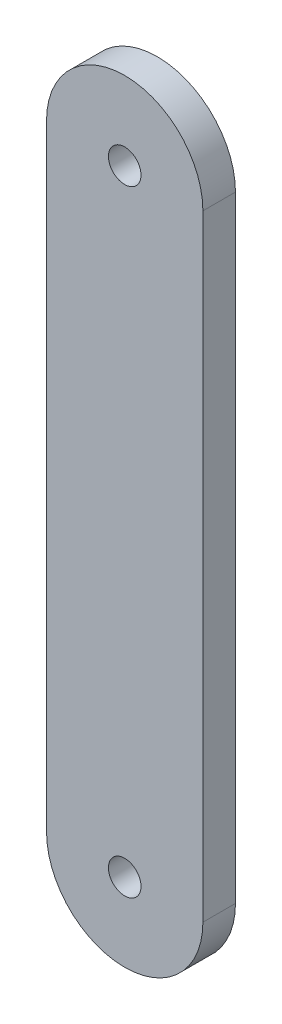
ISO-10303-21;
HEADER;
FILE_DESCRIPTION(('STEP AP214'),'2;1');
FILE_NAME('part.step','',(''),(''),'','','');
FILE_SCHEMA(('AUTOMOTIVE_DESIGN { 1 0 10303 214 1 1 1 1 }'));
ENDSEC;
DATA;
#1=APPLICATION_CONTEXT('core data for automotive mechanical design processes');
#2=APPLICATION_PROTOCOL_DEFINITION('international standard','automotive_design',2000,#1);
#3=PRODUCT_CONTEXT('',#1,'mechanical');
#4=PRODUCT('Part','Part','',(#3));
#5=PRODUCT_RELATED_PRODUCT_CATEGORY('part','',(#4));
#6=PRODUCT_DEFINITION_FORMATION('','',#4);
#7=PRODUCT_DEFINITION_CONTEXT('part definition',#1,'design');
#8=PRODUCT_DEFINITION('design','',#6,#7);
#9=PRODUCT_DEFINITION_SHAPE('','',#8);
#10=(LENGTH_UNIT() NAMED_UNIT(*) SI_UNIT(.MILLI.,.METRE.));
#11=(NAMED_UNIT(*) PLANE_ANGLE_UNIT() SI_UNIT($,.RADIAN.));
#12=(NAMED_UNIT(*) SI_UNIT($,.STERADIAN.) SOLID_ANGLE_UNIT());
#13=UNCERTAINTY_MEASURE_WITH_UNIT(LENGTH_MEASURE(1.E-05),#10,'distance_accuracy_value','');
#14=(GEOMETRIC_REPRESENTATION_CONTEXT(3) GLOBAL_UNCERTAINTY_ASSIGNED_CONTEXT((#13)) GLOBAL_UNIT_ASSIGNED_CONTEXT((#10,
#11,#12)) REPRESENTATION_CONTEXT('',''));
#15=CARTESIAN_POINT('',(0.,0.,0.));
#16=DIRECTION('',(0.,0.,1.));
#17=DIRECTION('',(1.,0.,0.));
#18=AXIS2_PLACEMENT_3D('',#15,#16,#17);
#19=CARTESIAN_POINT('',(0.,-47.2800000000001,0.));
#20=DIRECTION('',(0.,0.,1.));
#21=DIRECTION('',(1.,0.,0.));
#22=AXIS2_PLACEMENT_3D('',#19,#20,#21);
#23=CYLINDRICAL_SURFACE('',#22,12.);
#24=CARTESIAN_POINT('',(0.,-47.2800000000001,5.));
#25=DIRECTION('',(0.,0.,1.));
#26=DIRECTION('',(1.,0.,0.));
#27=AXIS2_PLACEMENT_3D('',#24,#25,#26);
#28=CIRCLE('',#27,12.);
#29=CARTESIAN_POINT('',(-12.,-47.28,5.));
#30=VERTEX_POINT('',#29);
#31=CARTESIAN_POINT('',(12.,-47.28,5.));
#32=VERTEX_POINT('',#31);
#33=EDGE_CURVE('E101',#30,#32,#28,.T.);
#34=ORIENTED_EDGE('',*,*,#33,.F.);
#35=DIRECTION('',(0.,0.,1.));
#36=VECTOR('',#35,1.);
#37=CARTESIAN_POINT('',(-12.,-47.28,0.));
#38=LINE('',#37,#36);
#39=CARTESIAN_POINT('',(-12.,-47.28,0.));
#40=VERTEX_POINT('',#39);
#41=EDGE_CURVE('E11',#40,#30,#38,.T.);
#42=ORIENTED_EDGE('',*,*,#41,.F.);
#43=CARTESIAN_POINT('',(0.,-47.2800000000001,0.));
#44=DIRECTION('',(0.,0.,1.));
#45=DIRECTION('',(1.,0.,0.));
#46=AXIS2_PLACEMENT_3D('',#43,#44,#45);
#47=CIRCLE('',#46,12.);
#48=CARTESIAN_POINT('',(12.,-47.28,0.));
#49=VERTEX_POINT('',#48);
#50=EDGE_CURVE('E94',#40,#49,#47,.T.);
#51=ORIENTED_EDGE('',*,*,#50,.T.);
#52=DIRECTION('',(0.,0.,1.));
#53=VECTOR('',#52,1.);
#54=CARTESIAN_POINT('',(12.,-47.28,0.));
#55=LINE('',#54,#53);
#56=EDGE_CURVE('E39',#49,#32,#55,.T.);
#57=ORIENTED_EDGE('',*,*,#56,.T.);
#58=EDGE_LOOP('',(#34,#42,#51,#57));
#59=FACE_BOUND('',#58,.T.);
#60=ADVANCED_FACE('F36',(#59),#23,.T.);
#61=CARTESIAN_POINT('',(-12.,47.28,0.));
#62=DIRECTION('',(-1.,0.,0.));
#63=DIRECTION('',(0.,0.,1.));
#64=AXIS2_PLACEMENT_3D('',#61,#62,#63);
#65=PLANE('',#64);
#66=DIRECTION('',(0.,-1.,0.));
#67=VECTOR('',#66,1.);
#68=CARTESIAN_POINT('',(-12.,47.28,5.));
#69=LINE('',#68,#67);
#70=CARTESIAN_POINT('',(-12.,47.28,5.));
#71=VERTEX_POINT('',#70);
#72=EDGE_CURVE('E96',#71,#30,#69,.T.);
#73=ORIENTED_EDGE('',*,*,#72,.F.);
#74=DIRECTION('',(0.,0.,1.));
#75=VECTOR('',#74,1.);
#76=CARTESIAN_POINT('',(-12.,47.28,0.));
#77=LINE('',#76,#75);
#78=CARTESIAN_POINT('',(-12.,47.28,0.));
#79=VERTEX_POINT('',#78);
#80=EDGE_CURVE('E45',#79,#71,#77,.T.);
#81=ORIENTED_EDGE('',*,*,#80,.F.);
#82=DIRECTION('',(0.,-1.,0.));
#83=VECTOR('',#82,1.);
#84=CARTESIAN_POINT('',(-12.,47.28,0.));
#85=LINE('',#84,#83);
#86=EDGE_CURVE('E91',#79,#40,#85,.T.);
#87=ORIENTED_EDGE('',*,*,#86,.T.);
#88=ORIENTED_EDGE('',*,*,#41,.T.);
#89=EDGE_LOOP('',(#73,#81,#87,#88));
#90=FACE_BOUND('',#89,.T.);
#91=ADVANCED_FACE('F112',(#90),#65,.T.);
#92=CARTESIAN_POINT('',(0.,47.2800000000001,0.));
#93=DIRECTION('',(0.,0.,1.));
#94=DIRECTION('',(1.,0.,0.));
#95=AXIS2_PLACEMENT_3D('',#92,#93,#94);
#96=CYLINDRICAL_SURFACE('',#95,12.);
#97=CARTESIAN_POINT('',(0.,47.2800000000001,5.));
#98=DIRECTION('',(0.,0.,1.));
#99=DIRECTION('',(1.,0.,0.));
#100=AXIS2_PLACEMENT_3D('',#97,#98,#99);
#101=CIRCLE('',#100,12.);
#102=CARTESIAN_POINT('',(12.,47.2800000000001,5.));
#103=VERTEX_POINT('',#102);
#104=EDGE_CURVE('E86',#103,#71,#101,.T.);
#105=ORIENTED_EDGE('',*,*,#104,.F.);
#106=DIRECTION('',(0.,0.,1.));
#107=VECTOR('',#106,1.);
#108=CARTESIAN_POINT('',(12.,47.2800000000001,0.));
#109=LINE('',#108,#107);
#110=CARTESIAN_POINT('',(12.,47.2800000000001,0.));
#111=VERTEX_POINT('',#110);
#112=EDGE_CURVE('E81',#111,#103,#109,.T.);
#113=ORIENTED_EDGE('',*,*,#112,.F.);
#114=CARTESIAN_POINT('',(0.,47.2800000000001,0.));
#115=DIRECTION('',(0.,0.,1.));
#116=DIRECTION('',(1.,0.,0.));
#117=AXIS2_PLACEMENT_3D('',#114,#115,#116);
#118=CIRCLE('',#117,12.);
#119=EDGE_CURVE('E84',#111,#79,#118,.T.);
#120=ORIENTED_EDGE('',*,*,#119,.T.);
#121=ORIENTED_EDGE('',*,*,#80,.T.);
#122=EDGE_LOOP('',(#105,#113,#120,#121));
#123=FACE_BOUND('',#122,.T.);
#124=ADVANCED_FACE('F83',(#123),#96,.T.);
#125=CARTESIAN_POINT('',(12.,-47.28,0.));
#126=DIRECTION('',(1.,0.,0.));
#127=DIRECTION('',(0.,1.,0.));
#128=AXIS2_PLACEMENT_3D('',#125,#126,#127);
#129=PLANE('',#128);
#130=DIRECTION('',(0.,1.,0.));
#131=VECTOR('',#130,1.);
#132=CARTESIAN_POINT('',(12.,-47.28,5.));
#133=LINE('',#132,#131);
#134=EDGE_CURVE('E104',#32,#103,#133,.T.);
#135=ORIENTED_EDGE('',*,*,#134,.F.);
#136=ORIENTED_EDGE('',*,*,#56,.F.);
#137=DIRECTION('',(0.,1.,0.));
#138=VECTOR('',#137,1.);
#139=CARTESIAN_POINT('',(12.,-47.28,0.));
#140=LINE('',#139,#138);
#141=EDGE_CURVE('E90',#49,#111,#140,.T.);
#142=ORIENTED_EDGE('',*,*,#141,.T.);
#143=ORIENTED_EDGE('',*,*,#112,.T.);
#144=EDGE_LOOP('',(#135,#136,#142,#143));
#145=FACE_BOUND('',#144,.T.);
#146=ADVANCED_FACE('F93',(#145),#129,.T.);
#147=CARTESIAN_POINT('',(0.,-47.2800000000001,0.));
#148=DIRECTION('',(0.,0.,1.));
#149=DIRECTION('',(1.,0.,0.));
#150=AXIS2_PLACEMENT_3D('',#147,#148,#149);
#151=PLANE('',#150);
#152=CARTESIAN_POINT('',(0.,47.2800000000001,0.));
#153=DIRECTION('',(0.,0.,1.));
#154=DIRECTION('',(-1.,0.,0.));
#155=AXIS2_PLACEMENT_3D('',#152,#153,#154);
#156=CIRCLE('',#155,2.5);
#157=CARTESIAN_POINT('',(-2.5,47.2800000000001,0.));
#158=VERTEX_POINT('',#157);
#159=EDGE_CURVE('E145',#158,#158,#156,.T.);
#160=ORIENTED_EDGE('',*,*,#159,.T.);
#161=EDGE_LOOP('',(#160));
#162=FACE_BOUND('',#161,.T.);
#163=CARTESIAN_POINT('',(0.,-47.2800000000001,0.));
#164=DIRECTION('',(0.,0.,1.));
#165=DIRECTION('',(-1.,0.,0.));
#166=AXIS2_PLACEMENT_3D('',#163,#164,#165);
#167=CIRCLE('',#166,2.5);
#168=CARTESIAN_POINT('',(-2.5,-47.2800000000001,0.));
#169=VERTEX_POINT('',#168);
#170=EDGE_CURVE('E105',#169,#169,#167,.T.);
#171=ORIENTED_EDGE('',*,*,#170,.T.);
#172=EDGE_LOOP('',(#171));
#173=FACE_BOUND('',#172,.T.);
#174=ORIENTED_EDGE('',*,*,#50,.F.);
#175=ORIENTED_EDGE('',*,*,#86,.F.);
#176=ORIENTED_EDGE('',*,*,#119,.F.);
#177=ORIENTED_EDGE('',*,*,#141,.F.);
#178=EDGE_LOOP('',(#174,#175,#176,#177));
#179=FACE_BOUND('',#178,.T.);
#180=ADVANCED_FACE('F89',(#162,#173,#179),#151,.F.);
#181=CARTESIAN_POINT('',(0.,-47.2800000000001,5.));
#182=DIRECTION('',(0.,0.,1.));
#183=DIRECTION('',(1.,0.,0.));
#184=AXIS2_PLACEMENT_3D('',#181,#182,#183);
#185=PLANE('',#184);
#186=CARTESIAN_POINT('',(0.,47.2800000000001,5.));
#187=DIRECTION('',(0.,0.,1.));
#188=DIRECTION('',(-1.,0.,0.));
#189=AXIS2_PLACEMENT_3D('',#186,#187,#188);
#190=CIRCLE('',#189,2.5);
#191=CARTESIAN_POINT('',(-2.5,47.2800000000001,5.));
#192=VERTEX_POINT('',#191);
#193=EDGE_CURVE('E148',#192,#192,#190,.T.);
#194=ORIENTED_EDGE('',*,*,#193,.F.);
#195=EDGE_LOOP('',(#194));
#196=FACE_BOUND('',#195,.T.);
#197=CARTESIAN_POINT('',(0.,-47.2800000000001,5.));
#198=DIRECTION('',(0.,0.,1.));
#199=DIRECTION('',(-1.,0.,0.));
#200=AXIS2_PLACEMENT_3D('',#197,#198,#199);
#201=CIRCLE('',#200,2.5);
#202=CARTESIAN_POINT('',(-2.5,-47.2800000000001,5.));
#203=VERTEX_POINT('',#202);
#204=EDGE_CURVE('E150',#203,#203,#201,.T.);
#205=ORIENTED_EDGE('',*,*,#204,.F.);
#206=EDGE_LOOP('',(#205));
#207=FACE_BOUND('',#206,.T.);
#208=ORIENTED_EDGE('',*,*,#33,.T.);
#209=ORIENTED_EDGE('',*,*,#134,.T.);
#210=ORIENTED_EDGE('',*,*,#104,.T.);
#211=ORIENTED_EDGE('',*,*,#72,.T.);
#212=EDGE_LOOP('',(#208,#209,#210,#211));
#213=FACE_BOUND('',#212,.T.);
#214=ADVANCED_FACE('F111',(#196,#207,#213),#185,.T.);
#215=CARTESIAN_POINT('',(0.,-47.2800000000001,0.));
#216=DIRECTION('',(0.,0.,1.));
#217=DIRECTION('',(1.,0.,0.));
#218=AXIS2_PLACEMENT_3D('',#215,#216,#217);
#219=CYLINDRICAL_SURFACE('',#218,2.5);
#220=ORIENTED_EDGE('',*,*,#170,.F.);
#221=EDGE_LOOP('',(#220));
#222=FACE_BOUND('',#221,.T.);
#223=ORIENTED_EDGE('',*,*,#204,.T.);
#224=EDGE_LOOP('',(#223));
#225=FACE_BOUND('',#224,.T.);
#226=ADVANCED_FACE('F130',(#222,#225),#219,.F.);
#227=CARTESIAN_POINT('',(0.,47.2800000000001,0.));
#228=DIRECTION('',(0.,0.,1.));
#229=DIRECTION('',(1.,0.,0.));
#230=AXIS2_PLACEMENT_3D('',#227,#228,#229);
#231=CYLINDRICAL_SURFACE('',#230,2.5);
#232=ORIENTED_EDGE('',*,*,#159,.F.);
#233=EDGE_LOOP('',(#232));
#234=FACE_BOUND('',#233,.T.);
#235=ORIENTED_EDGE('',*,*,#193,.T.);
#236=EDGE_LOOP('',(#235));
#237=FACE_BOUND('',#236,.T.);
#238=ADVANCED_FACE('F137',(#234,#237),#231,.F.);
#239=CLOSED_SHELL('',(#60,#91,#124,#146,#180,#214,#226,#238));
#240=MANIFOLD_SOLID_BREP('B2',#239);
#241=ADVANCED_BREP_SHAPE_REPRESENTATION('',(#18,#240),#14);
#242=SHAPE_DEFINITION_REPRESENTATION(#9,#241);
ENDSEC;
END-ISO-10303-21;
